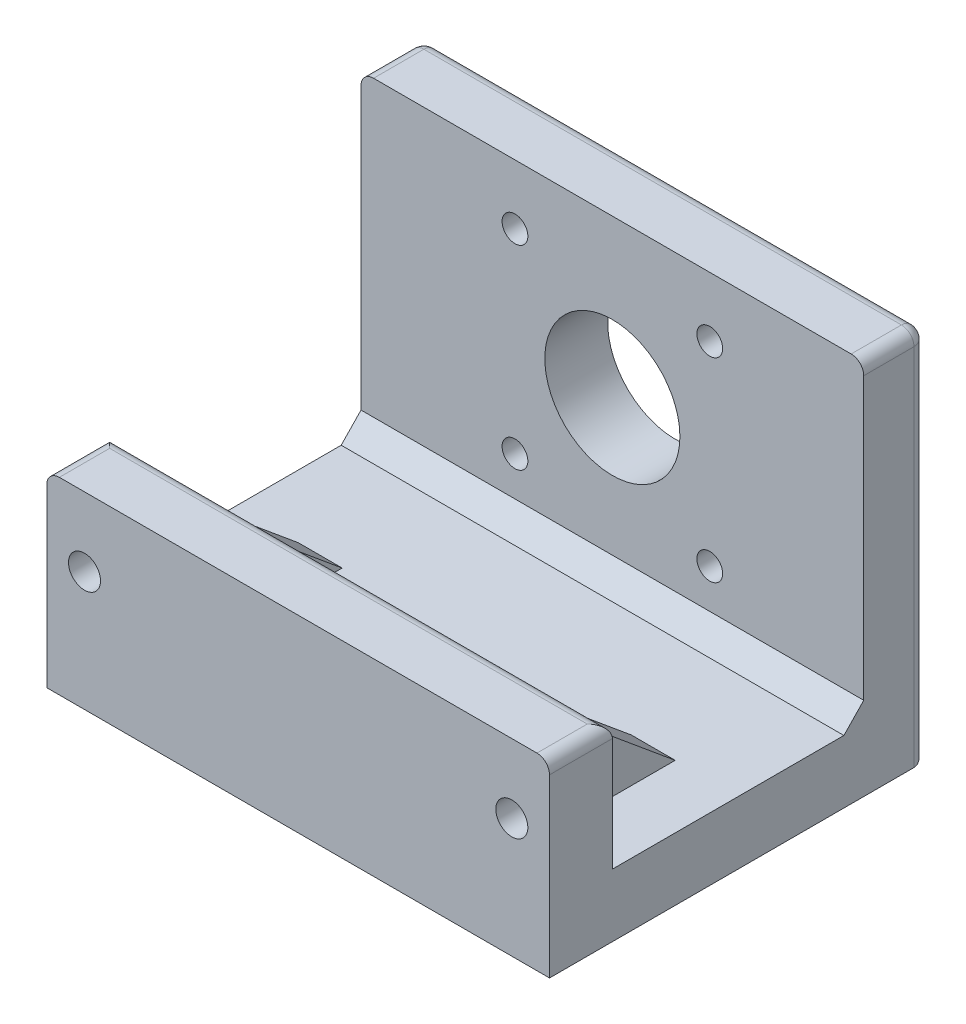
ISO-10303-21;
HEADER;
FILE_DESCRIPTION(('STEP AP214'),'2;1');
FILE_NAME('part.step','',(''),(''),'','','');
FILE_SCHEMA(('AUTOMOTIVE_DESIGN { 1 0 10303 214 1 1 1 1 }'));
ENDSEC;
DATA;
#1=APPLICATION_CONTEXT('core data for automotive mechanical design processes');
#2=APPLICATION_PROTOCOL_DEFINITION('international standard','automotive_design',2000,#1);
#3=PRODUCT_CONTEXT('',#1,'mechanical');
#4=PRODUCT('Part','Part','',(#3));
#5=PRODUCT_RELATED_PRODUCT_CATEGORY('part','',(#4));
#6=PRODUCT_DEFINITION_FORMATION('','',#4);
#7=PRODUCT_DEFINITION_CONTEXT('part definition',#1,'design');
#8=PRODUCT_DEFINITION('design','',#6,#7);
#9=PRODUCT_DEFINITION_SHAPE('','',#8);
#10=(LENGTH_UNIT() NAMED_UNIT(*) SI_UNIT(.MILLI.,.METRE.));
#11=(NAMED_UNIT(*) PLANE_ANGLE_UNIT() SI_UNIT($,.RADIAN.));
#12=(NAMED_UNIT(*) SI_UNIT($,.STERADIAN.) SOLID_ANGLE_UNIT());
#13=UNCERTAINTY_MEASURE_WITH_UNIT(LENGTH_MEASURE(1.E-05),#10,'distance_accuracy_value','');
#14=(GEOMETRIC_REPRESENTATION_CONTEXT(3) GLOBAL_UNCERTAINTY_ASSIGNED_CONTEXT((#13)) GLOBAL_UNIT_ASSIGNED_CONTEXT((#10,
#11,#12)) REPRESENTATION_CONTEXT('',''));
#15=CARTESIAN_POINT('',(0.,0.,0.));
#16=DIRECTION('',(0.,0.,1.));
#17=DIRECTION('',(1.,0.,0.));
#18=AXIS2_PLACEMENT_3D('',#15,#16,#17);
#19=CARTESIAN_POINT('',(0.,10.,0.));
#20=DIRECTION('',(0.,1.,0.));
#21=DIRECTION('',(0.,0.,1.));
#22=AXIS2_PLACEMENT_3D('',#19,#20,#21);
#23=PLANE('',#22);
#24=DIRECTION('',(0.,0.,-1.));
#25=VECTOR('',#24,1.);
#26=CARTESIAN_POINT('',(40.,10.,30.));
#27=LINE('',#26,#25);
#28=CARTESIAN_POINT('',(40.,10.,20.));
#29=VERTEX_POINT('',#28);
#30=CARTESIAN_POINT('',(40.,10.,-16.8467710974386));
#31=VERTEX_POINT('',#30);
#32=EDGE_CURVE('E207',#29,#31,#27,.T.);
#33=ORIENTED_EDGE('',*,*,#32,.T.);
#34=DIRECTION('',(-1.,0.,0.));
#35=VECTOR('',#34,1.);
#36=CARTESIAN_POINT('',(40.,10.,-16.8467710974386));
#37=LINE('',#36,#35);
#38=CARTESIAN_POINT('',(-40.,10.,-16.8467710974386));
#39=VERTEX_POINT('',#38);
#40=EDGE_CURVE('E187',#31,#39,#37,.T.);
#41=ORIENTED_EDGE('',*,*,#40,.T.);
#42=DIRECTION('',(0.,0.,1.));
#43=VECTOR('',#42,1.);
#44=CARTESIAN_POINT('',(-40.,10.,30.));
#45=LINE('',#44,#43);
#46=CARTESIAN_POINT('',(-40.,10.,20.));
#47=VERTEX_POINT('',#46);
#48=EDGE_CURVE('E230',#39,#47,#45,.T.);
#49=ORIENTED_EDGE('',*,*,#48,.T.);
#50=DIRECTION('',(1.,0.,0.));
#51=VECTOR('',#50,1.);
#52=CARTESIAN_POINT('',(47.9449323667304,10.,20.));
#53=LINE('',#52,#51);
#54=CARTESIAN_POINT('',(-30.,10.,20.));
#55=VERTEX_POINT('',#54);
#56=EDGE_CURVE('E378',#47,#55,#53,.T.);
#57=ORIENTED_EDGE('',*,*,#56,.T.);
#58=DIRECTION('',(0.,0.,1.));
#59=VECTOR('',#58,1.);
#60=CARTESIAN_POINT('',(-30.,10.,0.));
#61=LINE('',#60,#59);
#62=CARTESIAN_POINT('',(-30.,10.,0.));
#63=VERTEX_POINT('',#62);
#64=EDGE_CURVE('E457',#63,#55,#61,.T.);
#65=ORIENTED_EDGE('',*,*,#64,.F.);
#66=DIRECTION('',(-1.,0.,0.));
#67=VECTOR('',#66,1.);
#68=CARTESIAN_POINT('',(-30.,10.,0.));
#69=LINE('',#68,#67);
#70=CARTESIAN_POINT('',(-23.,10.,0.));
#71=VERTEX_POINT('',#70);
#72=EDGE_CURVE('E460',#71,#63,#69,.T.);
#73=ORIENTED_EDGE('',*,*,#72,.F.);
#74=DIRECTION('',(0.,0.,1.));
#75=VECTOR('',#74,1.);
#76=CARTESIAN_POINT('',(-23.,10.,0.));
#77=LINE('',#76,#75);
#78=CARTESIAN_POINT('',(-23.,10.,20.));
#79=VERTEX_POINT('',#78);
#80=EDGE_CURVE('E454',#71,#79,#77,.T.);
#81=ORIENTED_EDGE('',*,*,#80,.T.);
#82=CARTESIAN_POINT('',(23.,10.,20.));
#83=VERTEX_POINT('',#82);
#84=EDGE_CURVE('E383',#79,#83,#53,.T.);
#85=ORIENTED_EDGE('',*,*,#84,.T.);
#86=DIRECTION('',(0.,0.,1.));
#87=VECTOR('',#86,1.);
#88=CARTESIAN_POINT('',(23.,10.,0.));
#89=LINE('',#88,#87);
#90=CARTESIAN_POINT('',(23.,10.,0.));
#91=VERTEX_POINT('',#90);
#92=EDGE_CURVE('E443',#91,#83,#89,.T.);
#93=ORIENTED_EDGE('',*,*,#92,.F.);
#94=DIRECTION('',(-1.,0.,0.));
#95=VECTOR('',#94,1.);
#96=CARTESIAN_POINT('',(30.,10.,0.));
#97=LINE('',#96,#95);
#98=CARTESIAN_POINT('',(30.,10.,0.));
#99=VERTEX_POINT('',#98);
#100=EDGE_CURVE('E446',#99,#91,#97,.T.);
#101=ORIENTED_EDGE('',*,*,#100,.F.);
#102=DIRECTION('',(0.,0.,1.));
#103=VECTOR('',#102,1.);
#104=CARTESIAN_POINT('',(30.,10.,0.));
#105=LINE('',#104,#103);
#106=CARTESIAN_POINT('',(30.,10.,20.));
#107=VERTEX_POINT('',#106);
#108=EDGE_CURVE('E433',#99,#107,#105,.T.);
#109=ORIENTED_EDGE('',*,*,#108,.T.);
#110=EDGE_CURVE('E384',#107,#29,#53,.T.);
#111=ORIENTED_EDGE('',*,*,#110,.T.);
#112=EDGE_LOOP('',(#33,#41,#49,#57,#65,#73,#81,#85,#93,#101,#109,#111));
#113=FACE_BOUND('',#112,.T.);
#114=ADVANCED_FACE('F42',(#113),#23,.T.);
#115=CARTESIAN_POINT('',(47.9449323667304,10.,-20.));
#116=DIRECTION('',(0.,0.,-1.));
#117=DIRECTION('',(-1.,0.,0.));
#118=AXIS2_PLACEMENT_3D('',#115,#116,#117);
#119=PLANE('',#118);
#120=CARTESIAN_POINT('',(0.,35.,-20.));
#121=DIRECTION('',(0.,0.,1.));
#122=DIRECTION('',(1.,0.,0.));
#123=AXIS2_PLACEMENT_3D('',#120,#121,#122);
#124=CIRCLE('',#123,10.75);
#125=CARTESIAN_POINT('',(10.75,35.,-20.));
#126=VERTEX_POINT('',#125);
#127=EDGE_CURVE('E401',#126,#126,#124,.T.);
#128=ORIENTED_EDGE('',*,*,#127,.F.);
#129=EDGE_LOOP('',(#128));
#130=FACE_BOUND('',#129,.T.);
#131=CARTESIAN_POINT('',(15.5,50.5000000000004,-20.));
#132=DIRECTION('',(0.,0.,1.));
#133=DIRECTION('',(1.,0.,0.));
#134=AXIS2_PLACEMENT_3D('',#131,#132,#133);
#135=CIRCLE('',#134,2.05);
#136=CARTESIAN_POINT('',(17.55,50.5000000000004,-20.));
#137=VERTEX_POINT('',#136);
#138=EDGE_CURVE('E407',#137,#137,#135,.T.);
#139=ORIENTED_EDGE('',*,*,#138,.F.);
#140=EDGE_LOOP('',(#139));
#141=FACE_BOUND('',#140,.T.);
#142=CARTESIAN_POINT('',(-15.4999999999997,19.5000000000002,-20.));
#143=DIRECTION('',(0.,0.,1.));
#144=DIRECTION('',(1.,0.,0.));
#145=AXIS2_PLACEMENT_3D('',#142,#143,#144);
#146=CIRCLE('',#145,2.05);
#147=CARTESIAN_POINT('',(-13.4499999999997,19.5000000000002,-20.));
#148=VERTEX_POINT('',#147);
#149=EDGE_CURVE('E410',#148,#148,#146,.T.);
#150=ORIENTED_EDGE('',*,*,#149,.F.);
#151=EDGE_LOOP('',(#150));
#152=FACE_BOUND('',#151,.T.);
#153=CARTESIAN_POINT('',(-15.5,50.5,-20.));
#154=DIRECTION('',(0.,0.,1.));
#155=DIRECTION('',(1.,0.,0.));
#156=AXIS2_PLACEMENT_3D('',#153,#154,#155);
#157=CIRCLE('',#156,2.05);
#158=CARTESIAN_POINT('',(-13.45,50.5,-20.));
#159=VERTEX_POINT('',#158);
#160=EDGE_CURVE('E421',#159,#159,#157,.T.);
#161=ORIENTED_EDGE('',*,*,#160,.F.);
#162=EDGE_LOOP('',(#161));
#163=FACE_BOUND('',#162,.T.);
#164=CARTESIAN_POINT('',(15.5000000000003,19.5000000000003,-20.));
#165=DIRECTION('',(0.,0.,1.));
#166=DIRECTION('',(1.,0.,0.));
#167=AXIS2_PLACEMENT_3D('',#164,#165,#166);
#168=CIRCLE('',#167,2.05);
#169=CARTESIAN_POINT('',(17.5500000000003,19.5000000000003,-20.));
#170=VERTEX_POINT('',#169);
#171=EDGE_CURVE('E415',#170,#170,#168,.T.);
#172=ORIENTED_EDGE('',*,*,#171,.F.);
#173=EDGE_LOOP('',(#172));
#174=FACE_BOUND('',#173,.T.);
#175=DIRECTION('',(-1.,0.,0.));
#176=VECTOR('',#175,1.);
#177=CARTESIAN_POINT('',(40.,13.27,-20.));
#178=LINE('',#177,#176);
#179=CARTESIAN_POINT('',(40.,13.27,-20.));
#180=VERTEX_POINT('',#179);
#181=CARTESIAN_POINT('',(-40.,13.27,-20.));
#182=VERTEX_POINT('',#181);
#183=EDGE_CURVE('E59',#180,#182,#178,.T.);
#184=ORIENTED_EDGE('',*,*,#183,.F.);
#185=DIRECTION('',(0.,-1.,0.));
#186=VECTOR('',#185,1.);
#187=CARTESIAN_POINT('',(40.,60.,-20.));
#188=LINE('',#187,#186);
#189=CARTESIAN_POINT('',(40.,58.,-20.));
#190=VERTEX_POINT('',#189);
#191=EDGE_CURVE('E198',#190,#180,#188,.T.);
#192=ORIENTED_EDGE('',*,*,#191,.F.);
#193=CARTESIAN_POINT('',(38.,58.,-20.));
#194=DIRECTION('',(0.,0.,-1.));
#195=DIRECTION('',(-1.,0.,0.));
#196=AXIS2_PLACEMENT_3D('',#193,#194,#195);
#197=CIRCLE('',#196,2.);
#198=CARTESIAN_POINT('',(38.,60.,-20.));
#199=VERTEX_POINT('',#198);
#200=EDGE_CURVE('E11',#190,#199,#197,.F.);
#201=ORIENTED_EDGE('',*,*,#200,.T.);
#202=DIRECTION('',(1.,0.,0.));
#203=VECTOR('',#202,1.);
#204=CARTESIAN_POINT('',(0.,60.,-20.));
#205=LINE('',#204,#203);
#206=CARTESIAN_POINT('',(-38.,60.,-20.));
#207=VERTEX_POINT('',#206);
#208=EDGE_CURVE('E227',#207,#199,#205,.T.);
#209=ORIENTED_EDGE('',*,*,#208,.F.);
#210=CARTESIAN_POINT('',(-38.,58.,-20.));
#211=DIRECTION('',(0.,0.,-1.));
#212=DIRECTION('',(-1.,0.,0.));
#213=AXIS2_PLACEMENT_3D('',#210,#211,#212);
#214=CIRCLE('',#213,2.);
#215=CARTESIAN_POINT('',(-40.,58.,-20.));
#216=VERTEX_POINT('',#215);
#217=EDGE_CURVE('E51',#207,#216,#214,.F.);
#218=ORIENTED_EDGE('',*,*,#217,.T.);
#219=DIRECTION('',(0.,1.,0.));
#220=VECTOR('',#219,1.);
#221=CARTESIAN_POINT('',(-40.,60.,-20.));
#222=LINE('',#221,#220);
#223=EDGE_CURVE('E201',#182,#216,#222,.T.);
#224=ORIENTED_EDGE('',*,*,#223,.F.);
#225=EDGE_LOOP('',(#184,#192,#201,#209,#218,#224));
#226=FACE_BOUND('',#225,.T.);
#227=ADVANCED_FACE('F197',(#130,#141,#152,#163,#174,#226),#119,.F.);
#228=CARTESIAN_POINT('',(47.9449323667304,10.,20.));
#229=DIRECTION('',(0.,0.,1.));
#230=DIRECTION('',(1.,0.,0.));
#231=AXIS2_PLACEMENT_3D('',#228,#229,#230);
#232=PLANE('',#231);
#233=CARTESIAN_POINT('',(34.,19.,20.));
#234=DIRECTION('',(0.,0.,-1.));
#235=DIRECTION('',(-1.,0.,0.));
#236=AXIS2_PLACEMENT_3D('',#233,#234,#235);
#237=CIRCLE('',#236,2.55);
#238=CARTESIAN_POINT('',(31.45,19.,20.));
#239=VERTEX_POINT('',#238);
#240=EDGE_CURVE('E436',#239,#239,#237,.T.);
#241=ORIENTED_EDGE('',*,*,#240,.F.);
#242=EDGE_LOOP('',(#241));
#243=FACE_BOUND('',#242,.T.);
#244=DIRECTION('',(0.,-1.,0.));
#245=VECTOR('',#244,1.);
#246=CARTESIAN_POINT('',(30.,10.,20.));
#247=LINE('',#246,#245);
#248=CARTESIAN_POINT('',(30.,26.5997799259736,20.));
#249=VERTEX_POINT('',#248);
#250=EDGE_CURVE('E452',#249,#107,#247,.T.);
#251=ORIENTED_EDGE('',*,*,#250,.F.);
#252=DIRECTION('',(1.,0.,0.));
#253=VECTOR('',#252,1.);
#254=CARTESIAN_POINT('',(30.,26.5997799259736,20.));
#255=LINE('',#254,#253);
#256=CARTESIAN_POINT('',(23.,26.5997799259736,20.));
#257=VERTEX_POINT('',#256);
#258=EDGE_CURVE('E447',#257,#249,#255,.T.);
#259=ORIENTED_EDGE('',*,*,#258,.F.);
#260=DIRECTION('',(0.,1.,0.));
#261=VECTOR('',#260,1.);
#262=CARTESIAN_POINT('',(23.,10.,20.));
#263=LINE('',#262,#261);
#264=EDGE_CURVE('E449',#83,#257,#263,.T.);
#265=ORIENTED_EDGE('',*,*,#264,.F.);
#266=ORIENTED_EDGE('',*,*,#84,.F.);
#267=DIRECTION('',(0.,-1.,0.));
#268=VECTOR('',#267,1.);
#269=CARTESIAN_POINT('',(-23.,10.,20.));
#270=LINE('',#269,#268);
#271=CARTESIAN_POINT('',(-23.,26.5997799259736,20.));
#272=VERTEX_POINT('',#271);
#273=EDGE_CURVE('E461',#272,#79,#270,.T.);
#274=ORIENTED_EDGE('',*,*,#273,.F.);
#275=DIRECTION('',(1.,0.,0.));
#276=VECTOR('',#275,1.);
#277=CARTESIAN_POINT('',(-30.,26.5997799259736,20.));
#278=LINE('',#277,#276);
#279=CARTESIAN_POINT('',(-30.,26.5997799259736,20.));
#280=VERTEX_POINT('',#279);
#281=EDGE_CURVE('E464',#280,#272,#278,.T.);
#282=ORIENTED_EDGE('',*,*,#281,.F.);
#283=DIRECTION('',(0.,1.,0.));
#284=VECTOR('',#283,1.);
#285=CARTESIAN_POINT('',(-30.,10.,20.));
#286=LINE('',#285,#284);
#287=EDGE_CURVE('E466',#55,#280,#286,.T.);
#288=ORIENTED_EDGE('',*,*,#287,.F.);
#289=ORIENTED_EDGE('',*,*,#56,.F.);
#290=DIRECTION('',(0.,-1.,0.));
#291=VECTOR('',#290,1.);
#292=CARTESIAN_POINT('',(-40.,60.,20.));
#293=LINE('',#292,#291);
#294=CARTESIAN_POINT('',(-40.,28.,20.));
#295=VERTEX_POINT('',#294);
#296=EDGE_CURVE('E374',#295,#47,#293,.T.);
#297=ORIENTED_EDGE('',*,*,#296,.F.);
#298=DIRECTION('',(-1.,0.,0.));
#299=VECTOR('',#298,1.);
#300=CARTESIAN_POINT('',(40.,28.,20.));
#301=LINE('',#300,#299);
#302=CARTESIAN_POINT('',(40.,28.,20.));
#303=VERTEX_POINT('',#302);
#304=EDGE_CURVE('E254',#295,#303,#301,.F.);
#305=ORIENTED_EDGE('',*,*,#304,.T.);
#306=DIRECTION('',(0.,1.,0.));
#307=VECTOR('',#306,1.);
#308=CARTESIAN_POINT('',(40.,60.,20.));
#309=LINE('',#308,#307);
#310=EDGE_CURVE('E211',#29,#303,#309,.T.);
#311=ORIENTED_EDGE('',*,*,#310,.F.);
#312=ORIENTED_EDGE('',*,*,#110,.F.);
#313=EDGE_LOOP('',(#251,#259,#265,#266,#274,#282,#288,#289,#297,#305,#311,#312));
#314=FACE_BOUND('',#313,.T.);
#315=CARTESIAN_POINT('',(-34.,19.,20.));
#316=DIRECTION('',(0.,0.,-1.));
#317=DIRECTION('',(-1.,0.,0.));
#318=AXIS2_PLACEMENT_3D('',#315,#316,#317);
#319=CIRCLE('',#318,2.55);
#320=CARTESIAN_POINT('',(-36.55,19.,20.));
#321=VERTEX_POINT('',#320);
#322=EDGE_CURVE('E429',#321,#321,#319,.T.);
#323=ORIENTED_EDGE('',*,*,#322,.F.);
#324=EDGE_LOOP('',(#323));
#325=FACE_BOUND('',#324,.T.);
#326=ADVANCED_FACE('F370',(#243,#314,#325),#232,.F.);
#327=CARTESIAN_POINT('',(40.,60.,30.));
#328=DIRECTION('',(-1.,0.,0.));
#329=DIRECTION('',(0.,0.,1.));
#330=AXIS2_PLACEMENT_3D('',#327,#328,#329);
#331=PLANE('',#330);
#332=ORIENTED_EDGE('',*,*,#310,.T.);
#333=DIRECTION('',(0.,0.,-1.));
#334=VECTOR('',#333,1.);
#335=CARTESIAN_POINT('',(40.,28.,30.));
#336=LINE('',#335,#334);
#337=CARTESIAN_POINT('',(40.,28.,30.));
#338=VERTEX_POINT('',#337);
#339=EDGE_CURVE('E252',#303,#338,#336,.F.);
#340=ORIENTED_EDGE('',*,*,#339,.T.);
#341=DIRECTION('',(0.,-1.,0.));
#342=VECTOR('',#341,1.);
#343=CARTESIAN_POINT('',(40.,60.,30.));
#344=LINE('',#343,#342);
#345=CARTESIAN_POINT('',(40.,0.,30.));
#346=VERTEX_POINT('',#345);
#347=EDGE_CURVE('E222',#338,#346,#344,.T.);
#348=ORIENTED_EDGE('',*,*,#347,.T.);
#349=DIRECTION('',(0.,0.,-1.));
#350=VECTOR('',#349,1.);
#351=CARTESIAN_POINT('',(40.,0.,30.));
#352=LINE('',#351,#350);
#353=CARTESIAN_POINT('',(40.,0.,-28.));
#354=VERTEX_POINT('',#353);
#355=EDGE_CURVE('E209',#346,#354,#352,.T.);
#356=ORIENTED_EDGE('',*,*,#355,.T.);
#357=DIRECTION('',(0.,-1.,0.));
#358=VECTOR('',#357,1.);
#359=CARTESIAN_POINT('',(40.,60.,-28.));
#360=LINE('',#359,#358);
#361=CARTESIAN_POINT('',(40.,58.,-28.));
#362=VERTEX_POINT('',#361);
#363=EDGE_CURVE('E250',#354,#362,#360,.F.);
#364=ORIENTED_EDGE('',*,*,#363,.T.);
#365=DIRECTION('',(0.,0.,-1.));
#366=VECTOR('',#365,1.);
#367=CARTESIAN_POINT('',(40.,58.,30.));
#368=LINE('',#367,#366);
#369=EDGE_CURVE('E206',#362,#190,#368,.F.);
#370=ORIENTED_EDGE('',*,*,#369,.T.);
#371=ORIENTED_EDGE('',*,*,#191,.T.);
#372=DIRECTION('',(0.,-0.719842687639517,0.694137237908986));
#373=VECTOR('',#372,1.);
#374=CARTESIAN_POINT('',(40.,13.27,-20.));
#375=LINE('',#374,#373);
#376=EDGE_CURVE('E184',#180,#31,#375,.T.);
#377=ORIENTED_EDGE('',*,*,#376,.T.);
#378=ORIENTED_EDGE('',*,*,#32,.F.);
#379=EDGE_LOOP('',(#332,#340,#348,#356,#364,#370,#371,#377,#378));
#380=FACE_BOUND('',#379,.T.);
#381=ADVANCED_FACE('F203',(#380),#331,.F.);
#382=CARTESIAN_POINT('',(-40.,60.,30.));
#383=DIRECTION('',(1.,0.,0.));
#384=DIRECTION('',(0.,0.,-1.));
#385=AXIS2_PLACEMENT_3D('',#382,#383,#384);
#386=PLANE('',#385);
#387=ORIENTED_EDGE('',*,*,#48,.F.);
#388=DIRECTION('',(0.,-0.719842687639517,0.694137237908986));
#389=VECTOR('',#388,1.);
#390=CARTESIAN_POINT('',(-40.,13.27,-20.));
#391=LINE('',#390,#389);
#392=EDGE_CURVE('E192',#182,#39,#391,.T.);
#393=ORIENTED_EDGE('',*,*,#392,.F.);
#394=ORIENTED_EDGE('',*,*,#223,.T.);
#395=DIRECTION('',(0.,0.,1.));
#396=VECTOR('',#395,1.);
#397=CARTESIAN_POINT('',(-40.,58.,30.));
#398=LINE('',#397,#396);
#399=CARTESIAN_POINT('',(-40.,58.,-28.));
#400=VERTEX_POINT('',#399);
#401=EDGE_CURVE('E245',#216,#400,#398,.F.);
#402=ORIENTED_EDGE('',*,*,#401,.T.);
#403=DIRECTION('',(0.,-1.,0.));
#404=VECTOR('',#403,1.);
#405=CARTESIAN_POINT('',(-40.,60.,-28.));
#406=LINE('',#405,#404);
#407=CARTESIAN_POINT('',(-40.,0.,-28.));
#408=VERTEX_POINT('',#407);
#409=EDGE_CURVE('E243',#400,#408,#406,.T.);
#410=ORIENTED_EDGE('',*,*,#409,.T.);
#411=DIRECTION('',(0.,0.,1.));
#412=VECTOR('',#411,1.);
#413=CARTESIAN_POINT('',(-40.,0.,30.));
#414=LINE('',#413,#412);
#415=CARTESIAN_POINT('',(-40.,0.,30.));
#416=VERTEX_POINT('',#415);
#417=EDGE_CURVE('E217',#408,#416,#414,.T.);
#418=ORIENTED_EDGE('',*,*,#417,.T.);
#419=DIRECTION('',(0.,-1.,0.));
#420=VECTOR('',#419,1.);
#421=CARTESIAN_POINT('',(-40.,60.,30.));
#422=LINE('',#421,#420);
#423=CARTESIAN_POINT('',(-40.,28.,30.));
#424=VERTEX_POINT('',#423);
#425=EDGE_CURVE('E224',#424,#416,#422,.T.);
#426=ORIENTED_EDGE('',*,*,#425,.F.);
#427=DIRECTION('',(0.,0.,1.));
#428=VECTOR('',#427,1.);
#429=CARTESIAN_POINT('',(-40.,28.,20.));
#430=LINE('',#429,#428);
#431=EDGE_CURVE('E247',#424,#295,#430,.F.);
#432=ORIENTED_EDGE('',*,*,#431,.T.);
#433=ORIENTED_EDGE('',*,*,#296,.T.);
#434=EDGE_LOOP('',(#387,#393,#394,#402,#410,#418,#426,#432,#433));
#435=FACE_BOUND('',#434,.T.);
#436=ADVANCED_FACE('F343',(#435),#386,.F.);
#437=CARTESIAN_POINT('',(-40.,60.,30.));
#438=DIRECTION('',(0.,0.,-1.));
#439=DIRECTION('',(-1.,0.,0.));
#440=AXIS2_PLACEMENT_3D('',#437,#438,#439);
#441=PLANE('',#440);
#442=CARTESIAN_POINT('',(34.,19.,30.));
#443=DIRECTION('',(0.,0.,-1.));
#444=DIRECTION('',(-1.,0.,0.));
#445=AXIS2_PLACEMENT_3D('',#442,#443,#444);
#446=CIRCLE('',#445,2.55);
#447=CARTESIAN_POINT('',(31.45,19.,30.));
#448=VERTEX_POINT('',#447);
#449=EDGE_CURVE('E285',#448,#448,#446,.T.);
#450=ORIENTED_EDGE('',*,*,#449,.T.);
#451=EDGE_LOOP('',(#450));
#452=FACE_BOUND('',#451,.T.);
#453=CARTESIAN_POINT('',(-34.,19.,30.));
#454=DIRECTION('',(0.,0.,-1.));
#455=DIRECTION('',(-1.,0.,0.));
#456=AXIS2_PLACEMENT_3D('',#453,#454,#455);
#457=CIRCLE('',#456,2.55);
#458=CARTESIAN_POINT('',(-36.55,19.,30.));
#459=VERTEX_POINT('',#458);
#460=EDGE_CURVE('E432',#459,#459,#457,.T.);
#461=ORIENTED_EDGE('',*,*,#460,.T.);
#462=EDGE_LOOP('',(#461));
#463=FACE_BOUND('',#462,.T.);
#464=DIRECTION('',(1.,0.,0.));
#465=VECTOR('',#464,1.);
#466=CARTESIAN_POINT('',(-40.,30.,30.));
#467=LINE('',#466,#465);
#468=CARTESIAN_POINT('',(-38.,30.,30.));
#469=VERTEX_POINT('',#468);
#470=CARTESIAN_POINT('',(38.,30.,30.));
#471=VERTEX_POINT('',#470);
#472=EDGE_CURVE('E385',#469,#471,#467,.T.);
#473=ORIENTED_EDGE('',*,*,#472,.F.);
#474=CARTESIAN_POINT('',(-38.,28.,30.));
#475=DIRECTION('',(0.,0.,-1.));
#476=DIRECTION('',(-1.,0.,0.));
#477=AXIS2_PLACEMENT_3D('',#474,#475,#476);
#478=CIRCLE('',#477,2.);
#479=EDGE_CURVE('E241',#469,#424,#478,.F.);
#480=ORIENTED_EDGE('',*,*,#479,.T.);
#481=ORIENTED_EDGE('',*,*,#425,.T.);
#482=DIRECTION('',(1.,0.,0.));
#483=VECTOR('',#482,1.);
#484=CARTESIAN_POINT('',(-40.,0.,30.));
#485=LINE('',#484,#483);
#486=EDGE_CURVE('E219',#416,#346,#485,.T.);
#487=ORIENTED_EDGE('',*,*,#486,.T.);
#488=ORIENTED_EDGE('',*,*,#347,.F.);
#489=CARTESIAN_POINT('',(38.,28.,30.));
#490=DIRECTION('',(0.,0.,-1.));
#491=DIRECTION('',(-1.,0.,0.));
#492=AXIS2_PLACEMENT_3D('',#489,#490,#491);
#493=CIRCLE('',#492,2.);
#494=EDGE_CURVE('E239',#338,#471,#493,.F.);
#495=ORIENTED_EDGE('',*,*,#494,.T.);
#496=EDGE_LOOP('',(#473,#480,#481,#487,#488,#495));
#497=FACE_BOUND('',#496,.T.);
#498=ADVANCED_FACE('F352',(#452,#463,#497),#441,.F.);
#499=CARTESIAN_POINT('',(0.,60.,0.));
#500=DIRECTION('',(0.,-1.,0.));
#501=DIRECTION('',(0.,0.,-1.));
#502=AXIS2_PLACEMENT_3D('',#499,#500,#501);
#503=PLANE('',#502);
#504=ORIENTED_EDGE('',*,*,#208,.T.);
#505=DIRECTION('',(0.,0.,-1.));
#506=VECTOR('',#505,1.);
#507=CARTESIAN_POINT('',(38.,60.,0.));
#508=LINE('',#507,#506);
#509=CARTESIAN_POINT('',(38.,60.,-28.));
#510=VERTEX_POINT('',#509);
#511=EDGE_CURVE('E272',#199,#510,#508,.T.);
#512=ORIENTED_EDGE('',*,*,#511,.T.);
#513=DIRECTION('',(-1.,0.,0.));
#514=VECTOR('',#513,1.);
#515=CARTESIAN_POINT('',(0.,60.,-28.));
#516=LINE('',#515,#514);
#517=CARTESIAN_POINT('',(-38.,60.,-28.));
#518=VERTEX_POINT('',#517);
#519=EDGE_CURVE('E268',#510,#518,#516,.T.);
#520=ORIENTED_EDGE('',*,*,#519,.T.);
#521=DIRECTION('',(0.,0.,1.));
#522=VECTOR('',#521,1.);
#523=CARTESIAN_POINT('',(-38.,60.,0.));
#524=LINE('',#523,#522);
#525=EDGE_CURVE('E270',#518,#207,#524,.T.);
#526=ORIENTED_EDGE('',*,*,#525,.T.);
#527=EDGE_LOOP('',(#504,#512,#520,#526));
#528=FACE_BOUND('',#527,.T.);
#529=ADVANCED_FACE('F316',(#528),#503,.F.);
#530=CARTESIAN_POINT('',(-40.,60.,-30.));
#531=DIRECTION('',(0.,0.,1.));
#532=DIRECTION('',(1.,0.,0.));
#533=AXIS2_PLACEMENT_3D('',#530,#531,#532);
#534=PLANE('',#533);
#535=DIRECTION('',(-1.,0.,0.));
#536=VECTOR('',#535,1.);
#537=CARTESIAN_POINT('',(-40.,58.,-30.));
#538=LINE('',#537,#536);
#539=CARTESIAN_POINT('',(-38.,58.,-30.));
#540=VERTEX_POINT('',#539);
#541=CARTESIAN_POINT('',(38.,58.,-30.));
#542=VERTEX_POINT('',#541);
#543=EDGE_CURVE('E257',#540,#542,#538,.F.);
#544=ORIENTED_EDGE('',*,*,#543,.T.);
#545=DIRECTION('',(0.,-1.,0.));
#546=VECTOR('',#545,1.);
#547=CARTESIAN_POINT('',(38.,60.,-30.));
#548=LINE('',#547,#546);
#549=CARTESIAN_POINT('',(38.,2.,-30.));
#550=VERTEX_POINT('',#549);
#551=EDGE_CURVE('E263',#542,#550,#548,.T.);
#552=ORIENTED_EDGE('',*,*,#551,.T.);
#553=DIRECTION('',(-1.,0.,0.));
#554=VECTOR('',#553,1.);
#555=CARTESIAN_POINT('',(-40.,2.,-30.));
#556=LINE('',#555,#554);
#557=CARTESIAN_POINT('',(-38.,2.,-30.));
#558=VERTEX_POINT('',#557);
#559=EDGE_CURVE('E261',#550,#558,#556,.T.);
#560=ORIENTED_EDGE('',*,*,#559,.T.);
#561=DIRECTION('',(0.,-1.,0.));
#562=VECTOR('',#561,1.);
#563=CARTESIAN_POINT('',(-38.,60.,-30.));
#564=LINE('',#563,#562);
#565=EDGE_CURVE('E259',#558,#540,#564,.F.);
#566=ORIENTED_EDGE('',*,*,#565,.T.);
#567=EDGE_LOOP('',(#544,#552,#560,#566));
#568=FACE_BOUND('',#567,.T.);
#569=CARTESIAN_POINT('',(15.5000000000003,19.5000000000003,-30.));
#570=DIRECTION('',(0.,0.,1.));
#571=DIRECTION('',(1.,0.,0.));
#572=AXIS2_PLACEMENT_3D('',#569,#570,#571);
#573=CIRCLE('',#572,2.05);
#574=CARTESIAN_POINT('',(17.5500000000003,19.5000000000003,-30.));
#575=VERTEX_POINT('',#574);
#576=EDGE_CURVE('E281',#575,#575,#573,.T.);
#577=ORIENTED_EDGE('',*,*,#576,.T.);
#578=EDGE_LOOP('',(#577));
#579=FACE_BOUND('',#578,.T.);
#580=CARTESIAN_POINT('',(-15.5,50.5,-30.));
#581=DIRECTION('',(0.,0.,1.));
#582=DIRECTION('',(1.,0.,0.));
#583=AXIS2_PLACEMENT_3D('',#580,#581,#582);
#584=CIRCLE('',#583,2.05);
#585=CARTESIAN_POINT('',(-13.45,50.5,-30.));
#586=VERTEX_POINT('',#585);
#587=EDGE_CURVE('E418',#586,#586,#584,.T.);
#588=ORIENTED_EDGE('',*,*,#587,.T.);
#589=EDGE_LOOP('',(#588));
#590=FACE_BOUND('',#589,.T.);
#591=CARTESIAN_POINT('',(-15.4999999999997,19.5000000000002,-30.));
#592=DIRECTION('',(0.,0.,1.));
#593=DIRECTION('',(1.,0.,0.));
#594=AXIS2_PLACEMENT_3D('',#591,#592,#593);
#595=CIRCLE('',#594,2.05);
#596=CARTESIAN_POINT('',(-13.4499999999997,19.5000000000002,-30.));
#597=VERTEX_POINT('',#596);
#598=EDGE_CURVE('E424',#597,#597,#595,.T.);
#599=ORIENTED_EDGE('',*,*,#598,.T.);
#600=EDGE_LOOP('',(#599));
#601=FACE_BOUND('',#600,.T.);
#602=CARTESIAN_POINT('',(15.5,50.5000000000004,-30.));
#603=DIRECTION('',(0.,0.,1.));
#604=DIRECTION('',(1.,0.,0.));
#605=AXIS2_PLACEMENT_3D('',#602,#603,#604);
#606=CIRCLE('',#605,2.05);
#607=CARTESIAN_POINT('',(17.55,50.5000000000004,-30.));
#608=VERTEX_POINT('',#607);
#609=EDGE_CURVE('E404',#608,#608,#606,.T.);
#610=ORIENTED_EDGE('',*,*,#609,.T.);
#611=EDGE_LOOP('',(#610));
#612=FACE_BOUND('',#611,.T.);
#613=CARTESIAN_POINT('',(0.,35.,-30.));
#614=DIRECTION('',(0.,0.,1.));
#615=DIRECTION('',(1.,0.,0.));
#616=AXIS2_PLACEMENT_3D('',#613,#614,#615);
#617=CIRCLE('',#616,10.75);
#618=CARTESIAN_POINT('',(10.75,35.,-30.));
#619=VERTEX_POINT('',#618);
#620=EDGE_CURVE('E393',#619,#619,#617,.T.);
#621=ORIENTED_EDGE('',*,*,#620,.T.);
#622=EDGE_LOOP('',(#621));
#623=FACE_BOUND('',#622,.T.);
#624=ADVANCED_FACE('F333',(#568,#579,#590,#601,#612,#623),#534,.F.);
#625=CARTESIAN_POINT('',(0.,0.,0.));
#626=DIRECTION('',(0.,-1.,0.));
#627=DIRECTION('',(0.,0.,-1.));
#628=AXIS2_PLACEMENT_3D('',#625,#626,#627);
#629=PLANE('',#628);
#630=CARTESIAN_POINT('',(-30.,0.,0.5));
#631=DIRECTION('',(0.,-1.,0.));
#632=DIRECTION('',(0.,0.,-1.));
#633=AXIS2_PLACEMENT_3D('',#630,#631,#632);
#634=CIRCLE('',#633,4.1);
#635=CARTESIAN_POINT('',(-30.,0.,-3.6));
#636=VERTEX_POINT('',#635);
#637=EDGE_CURVE('E396',#636,#636,#634,.T.);
#638=ORIENTED_EDGE('',*,*,#637,.F.);
#639=EDGE_LOOP('',(#638));
#640=FACE_BOUND('',#639,.T.);
#641=CARTESIAN_POINT('',(30.,0.,0.500000000000007));
#642=DIRECTION('',(0.,-1.,0.));
#643=DIRECTION('',(0.,0.,1.));
#644=AXIS2_PLACEMENT_3D('',#641,#642,#643);
#645=CIRCLE('',#644,4.1);
#646=CARTESIAN_POINT('',(30.,0.,4.60000000000001));
#647=VERTEX_POINT('',#646);
#648=EDGE_CURVE('E389',#647,#647,#645,.T.);
#649=ORIENTED_EDGE('',*,*,#648,.F.);
#650=EDGE_LOOP('',(#649));
#651=FACE_BOUND('',#650,.T.);
#652=ORIENTED_EDGE('',*,*,#417,.F.);
#653=DIRECTION('',(-1.,0.,0.));
#654=VECTOR('',#653,1.);
#655=CARTESIAN_POINT('',(40.,0.,-28.));
#656=LINE('',#655,#654);
#657=EDGE_CURVE('E266',#408,#354,#656,.F.);
#658=ORIENTED_EDGE('',*,*,#657,.T.);
#659=ORIENTED_EDGE('',*,*,#355,.F.);
#660=ORIENTED_EDGE('',*,*,#486,.F.);
#661=EDGE_LOOP('',(#652,#658,#659,#660));
#662=FACE_BOUND('',#661,.T.);
#663=ADVANCED_FACE('F347',(#640,#651,#662),#629,.T.);
#664=CARTESIAN_POINT('',(0.,30.,0.));
#665=DIRECTION('',(0.,1.,0.));
#666=DIRECTION('',(0.,0.,1.));
#667=AXIS2_PLACEMENT_3D('',#664,#665,#666);
#668=PLANE('',#667);
#669=DIRECTION('',(-1.,0.,0.));
#670=VECTOR('',#669,1.);
#671=CARTESIAN_POINT('',(-40.,30.,22.));
#672=LINE('',#671,#670);
#673=CARTESIAN_POINT('',(38.,30.,22.));
#674=VERTEX_POINT('',#673);
#675=CARTESIAN_POINT('',(-38.,30.,22.));
#676=VERTEX_POINT('',#675);
#677=EDGE_CURVE('E232',#674,#676,#672,.T.);
#678=ORIENTED_EDGE('',*,*,#677,.T.);
#679=DIRECTION('',(0.,0.,1.));
#680=VECTOR('',#679,1.);
#681=CARTESIAN_POINT('',(-38.,30.,30.));
#682=LINE('',#681,#680);
#683=EDGE_CURVE('E236',#676,#469,#682,.T.);
#684=ORIENTED_EDGE('',*,*,#683,.T.);
#685=ORIENTED_EDGE('',*,*,#472,.T.);
#686=DIRECTION('',(0.,0.,-1.));
#687=VECTOR('',#686,1.);
#688=CARTESIAN_POINT('',(38.,30.,20.));
#689=LINE('',#688,#687);
#690=EDGE_CURVE('E234',#471,#674,#689,.T.);
#691=ORIENTED_EDGE('',*,*,#690,.T.);
#692=EDGE_LOOP('',(#678,#684,#685,#691));
#693=FACE_BOUND('',#692,.T.);
#694=ADVANCED_FACE('F522',(#693),#668,.T.);
#695=CARTESIAN_POINT('',(30.,7.,0.500000000000007));
#696=DIRECTION('',(0.,-1.,0.));
#697=DIRECTION('',(0.,0.,-1.));
#698=AXIS2_PLACEMENT_3D('',#695,#696,#697);
#699=CYLINDRICAL_SURFACE('',#698,4.1);
#700=CARTESIAN_POINT('',(30.,7.,0.500000000000007));
#701=DIRECTION('',(0.,-1.,0.));
#702=DIRECTION('',(0.,0.,1.));
#703=AXIS2_PLACEMENT_3D('',#700,#701,#702);
#704=CIRCLE('',#703,4.1);
#705=CARTESIAN_POINT('',(30.,7.,4.60000000000001));
#706=VERTEX_POINT('',#705);
#707=EDGE_CURVE('E392',#706,#706,#704,.T.);
#708=ORIENTED_EDGE('',*,*,#707,.F.);
#709=EDGE_LOOP('',(#708));
#710=FACE_BOUND('',#709,.T.);
#711=ORIENTED_EDGE('',*,*,#648,.T.);
#712=EDGE_LOOP('',(#711));
#713=FACE_BOUND('',#712,.T.);
#714=ADVANCED_FACE('F644',(#710,#713),#699,.F.);
#715=CARTESIAN_POINT('',(30.,7.,0.500000000000007));
#716=DIRECTION('',(0.,1.,0.));
#717=DIRECTION('',(0.,0.,1.));
#718=AXIS2_PLACEMENT_3D('',#715,#716,#717);
#719=PLANE('',#718);
#720=ORIENTED_EDGE('',*,*,#707,.T.);
#721=EDGE_LOOP('',(#720));
#722=FACE_BOUND('',#721,.T.);
#723=ADVANCED_FACE('F636',(#722),#719,.F.);
#724=CARTESIAN_POINT('',(-30.,7.,0.5));
#725=DIRECTION('',(0.,-1.,0.));
#726=DIRECTION('',(0.,0.,-1.));
#727=AXIS2_PLACEMENT_3D('',#724,#725,#726);
#728=CYLINDRICAL_SURFACE('',#727,4.1);
#729=CARTESIAN_POINT('',(-30.,7.,0.5));
#730=DIRECTION('',(0.,-1.,0.));
#731=DIRECTION('',(0.,0.,-1.));
#732=AXIS2_PLACEMENT_3D('',#729,#730,#731);
#733=CIRCLE('',#732,4.1);
#734=CARTESIAN_POINT('',(-30.,7.,-3.6));
#735=VERTEX_POINT('',#734);
#736=EDGE_CURVE('E388',#735,#735,#733,.T.);
#737=ORIENTED_EDGE('',*,*,#736,.F.);
#738=EDGE_LOOP('',(#737));
#739=FACE_BOUND('',#738,.T.);
#740=ORIENTED_EDGE('',*,*,#637,.T.);
#741=EDGE_LOOP('',(#740));
#742=FACE_BOUND('',#741,.T.);
#743=ADVANCED_FACE('F628',(#739,#742),#728,.F.);
#744=CARTESIAN_POINT('',(-30.,7.,0.5));
#745=DIRECTION('',(0.,-1.,0.));
#746=DIRECTION('',(0.,0.,-1.));
#747=AXIS2_PLACEMENT_3D('',#744,#745,#746);
#748=PLANE('',#747);
#749=ORIENTED_EDGE('',*,*,#736,.T.);
#750=EDGE_LOOP('',(#749));
#751=FACE_BOUND('',#750,.T.);
#752=ADVANCED_FACE('F620',(#751),#748,.T.);
#753=CARTESIAN_POINT('',(0.,35.,-30.));
#754=DIRECTION('',(0.,0.,1.));
#755=DIRECTION('',(1.,0.,0.));
#756=AXIS2_PLACEMENT_3D('',#753,#754,#755);
#757=CYLINDRICAL_SURFACE('',#756,10.75);
#758=ORIENTED_EDGE('',*,*,#620,.F.);
#759=EDGE_LOOP('',(#758));
#760=FACE_BOUND('',#759,.T.);
#761=ORIENTED_EDGE('',*,*,#127,.T.);
#762=EDGE_LOOP('',(#761));
#763=FACE_BOUND('',#762,.T.);
#764=ADVANCED_FACE('F612',(#760,#763),#757,.F.);
#765=CARTESIAN_POINT('',(15.5,50.5000000000004,-30.));
#766=DIRECTION('',(0.,0.,1.));
#767=DIRECTION('',(1.,0.,0.));
#768=AXIS2_PLACEMENT_3D('',#765,#766,#767);
#769=CYLINDRICAL_SURFACE('',#768,2.05);
#770=ORIENTED_EDGE('',*,*,#609,.F.);
#771=EDGE_LOOP('',(#770));
#772=FACE_BOUND('',#771,.T.);
#773=ORIENTED_EDGE('',*,*,#138,.T.);
#774=EDGE_LOOP('',(#773));
#775=FACE_BOUND('',#774,.T.);
#776=ADVANCED_FACE('F604',(#772,#775),#769,.F.);
#777=CARTESIAN_POINT('',(-15.4999999999997,19.5000000000002,-30.));
#778=DIRECTION('',(0.,0.,1.));
#779=DIRECTION('',(1.,0.,0.));
#780=AXIS2_PLACEMENT_3D('',#777,#778,#779);
#781=CYLINDRICAL_SURFACE('',#780,2.05);
#782=ORIENTED_EDGE('',*,*,#598,.F.);
#783=EDGE_LOOP('',(#782));
#784=FACE_BOUND('',#783,.T.);
#785=ORIENTED_EDGE('',*,*,#149,.T.);
#786=EDGE_LOOP('',(#785));
#787=FACE_BOUND('',#786,.T.);
#788=ADVANCED_FACE('F596',(#784,#787),#781,.F.);
#789=CARTESIAN_POINT('',(-15.5,50.5,-30.));
#790=DIRECTION('',(0.,0.,1.));
#791=DIRECTION('',(1.,0.,0.));
#792=AXIS2_PLACEMENT_3D('',#789,#790,#791);
#793=CYLINDRICAL_SURFACE('',#792,2.05);
#794=ORIENTED_EDGE('',*,*,#587,.F.);
#795=EDGE_LOOP('',(#794));
#796=FACE_BOUND('',#795,.T.);
#797=ORIENTED_EDGE('',*,*,#160,.T.);
#798=EDGE_LOOP('',(#797));
#799=FACE_BOUND('',#798,.T.);
#800=ADVANCED_FACE('F587',(#796,#799),#793,.F.);
#801=CARTESIAN_POINT('',(15.5000000000003,19.5000000000003,-30.));
#802=DIRECTION('',(0.,0.,1.));
#803=DIRECTION('',(1.,0.,0.));
#804=AXIS2_PLACEMENT_3D('',#801,#802,#803);
#805=CYLINDRICAL_SURFACE('',#804,2.05);
#806=ORIENTED_EDGE('',*,*,#576,.F.);
#807=EDGE_LOOP('',(#806));
#808=FACE_BOUND('',#807,.T.);
#809=ORIENTED_EDGE('',*,*,#171,.T.);
#810=EDGE_LOOP('',(#809));
#811=FACE_BOUND('',#810,.T.);
#812=ADVANCED_FACE('F548',(#808,#811),#805,.F.);
#813=CARTESIAN_POINT('',(38.,28.,0.));
#814=DIRECTION('',(0.,0.,1.));
#815=DIRECTION('',(1.,0.,0.));
#816=AXIS2_PLACEMENT_3D('',#813,#814,#815);
#817=CYLINDRICAL_SURFACE('',#816,2.);
#818=ORIENTED_EDGE('',*,*,#494,.F.);
#819=ORIENTED_EDGE('',*,*,#339,.F.);
#820=CARTESIAN_POINT('',(38.,28.,22.));
#821=DIRECTION('',(0.707106781186548,0.,0.707106781186547));
#822=DIRECTION('',(0.707106781186547,0.,-0.707106781186548));
#823=AXIS2_PLACEMENT_3D('',#820,#821,#822);
#824=ELLIPSE('',#823,2.82842712474619,2.);
#825=EDGE_CURVE('E278',#674,#303,#824,.F.);
#826=ORIENTED_EDGE('',*,*,#825,.F.);
#827=ORIENTED_EDGE('',*,*,#690,.F.);
#828=EDGE_LOOP('',(#818,#819,#826,#827));
#829=FACE_BOUND('',#828,.T.);
#830=ADVANCED_FACE('F376',(#829),#817,.T.);
#831=CARTESIAN_POINT('',(0.,28.,22.));
#832=DIRECTION('',(1.,0.,0.));
#833=DIRECTION('',(0.,0.,-1.));
#834=AXIS2_PLACEMENT_3D('',#831,#832,#833);
#835=CYLINDRICAL_SURFACE('',#834,2.);
#836=ORIENTED_EDGE('',*,*,#825,.T.);
#837=ORIENTED_EDGE('',*,*,#304,.F.);
#838=CARTESIAN_POINT('',(-38.,28.,22.));
#839=DIRECTION('',(0.707106781186547,0.,-0.707106781186548));
#840=DIRECTION('',(0.707106781186548,0.,0.707106781186547));
#841=AXIS2_PLACEMENT_3D('',#838,#839,#840);
#842=ELLIPSE('',#841,2.82842712474619,2.);
#843=EDGE_CURVE('E275',#676,#295,#842,.F.);
#844=ORIENTED_EDGE('',*,*,#843,.F.);
#845=ORIENTED_EDGE('',*,*,#677,.F.);
#846=EDGE_LOOP('',(#836,#837,#844,#845));
#847=FACE_BOUND('',#846,.T.);
#848=ADVANCED_FACE('F364',(#847),#835,.T.);
#849=CARTESIAN_POINT('',(-38.,28.,0.));
#850=DIRECTION('',(0.,0.,-1.));
#851=DIRECTION('',(-1.,0.,0.));
#852=AXIS2_PLACEMENT_3D('',#849,#850,#851);
#853=CYLINDRICAL_SURFACE('',#852,2.);
#854=ORIENTED_EDGE('',*,*,#843,.T.);
#855=ORIENTED_EDGE('',*,*,#431,.F.);
#856=ORIENTED_EDGE('',*,*,#479,.F.);
#857=ORIENTED_EDGE('',*,*,#683,.F.);
#858=EDGE_LOOP('',(#854,#855,#856,#857));
#859=FACE_BOUND('',#858,.T.);
#860=ADVANCED_FACE('F358',(#859),#853,.T.);
#861=CARTESIAN_POINT('',(-38.,58.,0.));
#862=DIRECTION('',(0.,0.,1.));
#863=DIRECTION('',(1.,0.,0.));
#864=AXIS2_PLACEMENT_3D('',#861,#862,#863);
#865=CYLINDRICAL_SURFACE('',#864,2.);
#866=CARTESIAN_POINT('',(-38.,58.,-28.));
#867=DIRECTION('',(0.,0.,-1.));
#868=DIRECTION('',(0.,1.,0.));
#869=AXIS2_PLACEMENT_3D('',#866,#867,#868);
#870=CIRCLE('',#869,2.);
#871=EDGE_CURVE('E46',#400,#518,#870,.T.);
#872=ORIENTED_EDGE('',*,*,#871,.F.);
#873=ORIENTED_EDGE('',*,*,#401,.F.);
#874=ORIENTED_EDGE('',*,*,#217,.F.);
#875=ORIENTED_EDGE('',*,*,#525,.F.);
#876=EDGE_LOOP('',(#872,#873,#874,#875));
#877=FACE_BOUND('',#876,.T.);
#878=ADVANCED_FACE('F44',(#877),#865,.T.);
#879=CARTESIAN_POINT('',(-38.,58.,-28.));
#880=DIRECTION('',(0.,0.,1.));
#881=DIRECTION('',(1.,0.,0.));
#882=AXIS2_PLACEMENT_3D('',#879,#880,#881);
#883=SPHERICAL_SURFACE('',#882,2.);
#884=CARTESIAN_POINT('',(-38.,58.,-28.));
#885=DIRECTION('',(0.,1.,0.));
#886=DIRECTION('',(0.,0.,1.));
#887=AXIS2_PLACEMENT_3D('',#884,#885,#886);
#888=CIRCLE('',#887,2.);
#889=EDGE_CURVE('E296',#400,#540,#888,.F.);
#890=ORIENTED_EDGE('',*,*,#889,.F.);
#891=ORIENTED_EDGE('',*,*,#871,.T.);
#892=CARTESIAN_POINT('',(-38.,58.,-28.));
#893=DIRECTION('',(-1.,0.,0.));
#894=DIRECTION('',(0.,0.,1.));
#895=AXIS2_PLACEMENT_3D('',#892,#893,#894);
#896=CIRCLE('',#895,2.);
#897=EDGE_CURVE('E298',#540,#518,#896,.F.);
#898=ORIENTED_EDGE('',*,*,#897,.F.);
#899=EDGE_LOOP('',(#890,#891,#898));
#900=FACE_BOUND('',#899,.T.);
#901=ADVANCED_FACE('F308',(#900),#883,.T.);
#902=CARTESIAN_POINT('',(38.,58.,0.));
#903=DIRECTION('',(0.,0.,-1.));
#904=DIRECTION('',(-1.,0.,0.));
#905=AXIS2_PLACEMENT_3D('',#902,#903,#904);
#906=CYLINDRICAL_SURFACE('',#905,2.);
#907=ORIENTED_EDGE('',*,*,#200,.F.);
#908=ORIENTED_EDGE('',*,*,#369,.F.);
#909=CARTESIAN_POINT('',(38.,58.,-28.));
#910=DIRECTION('',(0.,0.,-1.));
#911=DIRECTION('',(-1.,0.,0.));
#912=AXIS2_PLACEMENT_3D('',#909,#910,#911);
#913=CIRCLE('',#912,2.);
#914=EDGE_CURVE('E293',#510,#362,#913,.T.);
#915=ORIENTED_EDGE('',*,*,#914,.F.);
#916=ORIENTED_EDGE('',*,*,#511,.F.);
#917=EDGE_LOOP('',(#907,#908,#915,#916));
#918=FACE_BOUND('',#917,.T.);
#919=ADVANCED_FACE('F319',(#918),#906,.T.);
#920=CARTESIAN_POINT('',(0.,58.,-28.));
#921=DIRECTION('',(-1.,0.,0.));
#922=DIRECTION('',(0.,0.,1.));
#923=AXIS2_PLACEMENT_3D('',#920,#921,#922);
#924=CYLINDRICAL_SURFACE('',#923,2.);
#925=ORIENTED_EDGE('',*,*,#897,.T.);
#926=ORIENTED_EDGE('',*,*,#519,.F.);
#927=CARTESIAN_POINT('',(38.,58.,-28.));
#928=DIRECTION('',(1.,0.,0.));
#929=DIRECTION('',(0.,1.,0.));
#930=AXIS2_PLACEMENT_3D('',#927,#928,#929);
#931=CIRCLE('',#930,2.);
#932=EDGE_CURVE('E290',#542,#510,#931,.T.);
#933=ORIENTED_EDGE('',*,*,#932,.F.);
#934=ORIENTED_EDGE('',*,*,#543,.F.);
#935=EDGE_LOOP('',(#925,#926,#933,#934));
#936=FACE_BOUND('',#935,.T.);
#937=ADVANCED_FACE('F322',(#936),#924,.T.);
#938=CARTESIAN_POINT('',(-38.,60.,-28.));
#939=DIRECTION('',(0.,-1.,0.));
#940=DIRECTION('',(0.,0.,-1.));
#941=AXIS2_PLACEMENT_3D('',#938,#939,#940);
#942=CYLINDRICAL_SURFACE('',#941,2.);
#943=ORIENTED_EDGE('',*,*,#889,.T.);
#944=ORIENTED_EDGE('',*,*,#565,.F.);
#945=CARTESIAN_POINT('',(-38.,2.,-28.));
#946=DIRECTION('',(0.707106781186547,-0.707106781186547,0.));
#947=DIRECTION('',(-0.707106781186547,-0.707106781186547,0.));
#948=AXIS2_PLACEMENT_3D('',#945,#946,#947);
#949=ELLIPSE('',#948,2.82842712474619,2.);
#950=EDGE_CURVE('E287',#408,#558,#949,.T.);
#951=ORIENTED_EDGE('',*,*,#950,.F.);
#952=ORIENTED_EDGE('',*,*,#409,.F.);
#953=EDGE_LOOP('',(#943,#944,#951,#952));
#954=FACE_BOUND('',#953,.T.);
#955=ADVANCED_FACE('F338',(#954),#942,.T.);
#956=CARTESIAN_POINT('',(38.,58.,-28.));
#957=DIRECTION('',(0.,0.,1.));
#958=DIRECTION('',(1.,0.,0.));
#959=AXIS2_PLACEMENT_3D('',#956,#957,#958);
#960=SPHERICAL_SURFACE('',#959,2.);
#961=ORIENTED_EDGE('',*,*,#932,.T.);
#962=ORIENTED_EDGE('',*,*,#914,.T.);
#963=CARTESIAN_POINT('',(38.,58.,-28.));
#964=DIRECTION('',(0.,1.,0.));
#965=DIRECTION('',(0.,0.,1.));
#966=AXIS2_PLACEMENT_3D('',#963,#964,#965);
#967=CIRCLE('',#966,2.);
#968=EDGE_CURVE('E284',#542,#362,#967,.F.);
#969=ORIENTED_EDGE('',*,*,#968,.F.);
#970=EDGE_LOOP('',(#961,#962,#969));
#971=FACE_BOUND('',#970,.T.);
#972=ADVANCED_FACE('F326',(#971),#960,.T.);
#973=CARTESIAN_POINT('',(-40.,2.,-28.));
#974=DIRECTION('',(1.,0.,0.));
#975=DIRECTION('',(0.,0.,-1.));
#976=AXIS2_PLACEMENT_3D('',#973,#974,#975);
#977=CYLINDRICAL_SURFACE('',#976,2.);
#978=ORIENTED_EDGE('',*,*,#950,.T.);
#979=ORIENTED_EDGE('',*,*,#559,.F.);
#980=CARTESIAN_POINT('',(38.,2.,-28.));
#981=DIRECTION('',(0.707106781186547,0.707106781186547,0.));
#982=DIRECTION('',(0.707106781186547,-0.707106781186547,0.));
#983=AXIS2_PLACEMENT_3D('',#980,#981,#982);
#984=ELLIPSE('',#983,2.82842712474619,2.);
#985=EDGE_CURVE('E282',#354,#550,#984,.T.);
#986=ORIENTED_EDGE('',*,*,#985,.F.);
#987=ORIENTED_EDGE('',*,*,#657,.F.);
#988=EDGE_LOOP('',(#978,#979,#986,#987));
#989=FACE_BOUND('',#988,.T.);
#990=ADVANCED_FACE('F551',(#989),#977,.T.);
#991=CARTESIAN_POINT('',(38.,60.,-28.));
#992=DIRECTION('',(0.,-1.,0.));
#993=DIRECTION('',(0.,0.,-1.));
#994=AXIS2_PLACEMENT_3D('',#991,#992,#993);
#995=CYLINDRICAL_SURFACE('',#994,2.);
#996=ORIENTED_EDGE('',*,*,#968,.T.);
#997=ORIENTED_EDGE('',*,*,#363,.F.);
#998=ORIENTED_EDGE('',*,*,#985,.T.);
#999=ORIENTED_EDGE('',*,*,#551,.F.);
#1000=EDGE_LOOP('',(#996,#997,#998,#999));
#1001=FACE_BOUND('',#1000,.T.);
#1002=ADVANCED_FACE('F329',(#1001),#995,.T.);
#1003=CARTESIAN_POINT('',(-34.,19.,30.));
#1004=DIRECTION('',(0.,0.,-1.));
#1005=DIRECTION('',(-1.,0.,0.));
#1006=AXIS2_PLACEMENT_3D('',#1003,#1004,#1005);
#1007=CYLINDRICAL_SURFACE('',#1006,2.55);
#1008=ORIENTED_EDGE('',*,*,#460,.F.);
#1009=EDGE_LOOP('',(#1008));
#1010=FACE_BOUND('',#1009,.T.);
#1011=ORIENTED_EDGE('',*,*,#322,.T.);
#1012=EDGE_LOOP('',(#1011));
#1013=FACE_BOUND('',#1012,.T.);
#1014=ADVANCED_FACE('F511',(#1010,#1013),#1007,.F.);
#1015=CARTESIAN_POINT('',(34.,19.,30.));
#1016=DIRECTION('',(0.,0.,-1.));
#1017=DIRECTION('',(-1.,0.,0.));
#1018=AXIS2_PLACEMENT_3D('',#1015,#1016,#1017);
#1019=CYLINDRICAL_SURFACE('',#1018,2.55);
#1020=ORIENTED_EDGE('',*,*,#449,.F.);
#1021=EDGE_LOOP('',(#1020));
#1022=FACE_BOUND('',#1021,.T.);
#1023=ORIENTED_EDGE('',*,*,#240,.T.);
#1024=EDGE_LOOP('',(#1023));
#1025=FACE_BOUND('',#1024,.T.);
#1026=ADVANCED_FACE('F504',(#1022,#1025),#1019,.F.);
#1027=CARTESIAN_POINT('',(30.,10.,0.));
#1028=DIRECTION('',(-1.,0.,0.));
#1029=DIRECTION('',(0.,-1.,0.));
#1030=AXIS2_PLACEMENT_3D('',#1027,#1028,#1029);
#1031=PLANE('',#1030);
#1032=ORIENTED_EDGE('',*,*,#108,.F.);
#1033=DIRECTION('',(0.,0.63866440984338,0.769485394013043));
#1034=VECTOR('',#1033,1.);
#1035=CARTESIAN_POINT('',(30.,10.,0.));
#1036=LINE('',#1035,#1034);
#1037=EDGE_CURVE('E469',#99,#249,#1036,.T.);
#1038=ORIENTED_EDGE('',*,*,#1037,.T.);
#1039=ORIENTED_EDGE('',*,*,#250,.T.);
#1040=EDGE_LOOP('',(#1032,#1038,#1039));
#1041=FACE_BOUND('',#1040,.T.);
#1042=ADVANCED_FACE('F502',(#1041),#1031,.F.);
#1043=CARTESIAN_POINT('',(23.,10.,0.));
#1044=DIRECTION('',(1.,0.,0.));
#1045=DIRECTION('',(0.,0.,-1.));
#1046=AXIS2_PLACEMENT_3D('',#1043,#1044,#1045);
#1047=PLANE('',#1046);
#1048=ORIENTED_EDGE('',*,*,#264,.T.);
#1049=DIRECTION('',(0.,-0.63866440984338,-0.769485394013043));
#1050=VECTOR('',#1049,1.);
#1051=CARTESIAN_POINT('',(23.,10.,0.));
#1052=LINE('',#1051,#1050);
#1053=EDGE_CURVE('E473',#257,#91,#1052,.T.);
#1054=ORIENTED_EDGE('',*,*,#1053,.T.);
#1055=ORIENTED_EDGE('',*,*,#92,.T.);
#1056=EDGE_LOOP('',(#1048,#1054,#1055));
#1057=FACE_BOUND('',#1056,.T.);
#1058=ADVANCED_FACE('F496',(#1057),#1047,.F.);
#1059=CARTESIAN_POINT('',(-30.,10.,0.));
#1060=DIRECTION('',(1.,0.,0.));
#1061=DIRECTION('',(0.,1.,0.));
#1062=AXIS2_PLACEMENT_3D('',#1059,#1060,#1061);
#1063=PLANE('',#1062);
#1064=ORIENTED_EDGE('',*,*,#287,.T.);
#1065=DIRECTION('',(0.,-0.63866440984338,-0.769485394013043));
#1066=VECTOR('',#1065,1.);
#1067=CARTESIAN_POINT('',(-30.,10.,0.));
#1068=LINE('',#1067,#1066);
#1069=EDGE_CURVE('E476',#280,#63,#1068,.T.);
#1070=ORIENTED_EDGE('',*,*,#1069,.T.);
#1071=ORIENTED_EDGE('',*,*,#64,.T.);
#1072=EDGE_LOOP('',(#1064,#1070,#1071));
#1073=FACE_BOUND('',#1072,.T.);
#1074=ADVANCED_FACE('F485',(#1073),#1063,.F.);
#1075=CARTESIAN_POINT('',(-23.,10.,0.));
#1076=DIRECTION('',(-1.,0.,0.));
#1077=DIRECTION('',(0.,-1.,0.));
#1078=AXIS2_PLACEMENT_3D('',#1075,#1076,#1077);
#1079=PLANE('',#1078);
#1080=ORIENTED_EDGE('',*,*,#80,.F.);
#1081=DIRECTION('',(0.,0.63866440984338,0.769485394013043));
#1082=VECTOR('',#1081,1.);
#1083=CARTESIAN_POINT('',(-23.,10.,0.));
#1084=LINE('',#1083,#1082);
#1085=EDGE_CURVE('E67',#71,#272,#1084,.T.);
#1086=ORIENTED_EDGE('',*,*,#1085,.T.);
#1087=ORIENTED_EDGE('',*,*,#273,.T.);
#1088=EDGE_LOOP('',(#1080,#1086,#1087));
#1089=FACE_BOUND('',#1088,.T.);
#1090=ADVANCED_FACE('F492',(#1089),#1079,.F.);
#1091=CARTESIAN_POINT('',(40.,9.99999999999998,0.));
#1092=DIRECTION('',(0.,-0.769485394013043,0.63866440984338));
#1093=DIRECTION('',(0.,-0.63866440984338,-0.769485394013043));
#1094=AXIS2_PLACEMENT_3D('',#1091,#1092,#1093);
#1095=PLANE('',#1094);
#1096=ORIENTED_EDGE('',*,*,#281,.T.);
#1097=ORIENTED_EDGE('',*,*,#1085,.F.);
#1098=ORIENTED_EDGE('',*,*,#72,.T.);
#1099=ORIENTED_EDGE('',*,*,#1069,.F.);
#1100=EDGE_LOOP('',(#1096,#1097,#1098,#1099));
#1101=FACE_BOUND('',#1100,.T.);
#1102=ADVANCED_FACE('F486',(#1101),#1095,.F.);
#1103=ORIENTED_EDGE('',*,*,#100,.T.);
#1104=ORIENTED_EDGE('',*,*,#1053,.F.);
#1105=ORIENTED_EDGE('',*,*,#258,.T.);
#1106=ORIENTED_EDGE('',*,*,#1037,.F.);
#1107=EDGE_LOOP('',(#1103,#1104,#1105,#1106));
#1108=FACE_BOUND('',#1107,.T.);
#1109=ADVANCED_FACE('F499',(#1108),#1095,.F.);
#1110=CARTESIAN_POINT('',(40.,13.27,-20.));
#1111=DIRECTION('',(0.,-0.694137237908986,-0.719842687639517));
#1112=DIRECTION('',(0.,0.719842687639517,-0.694137237908986));
#1113=AXIS2_PLACEMENT_3D('',#1110,#1111,#1112);
#1114=PLANE('',#1113);
#1115=ORIENTED_EDGE('',*,*,#392,.T.);
#1116=ORIENTED_EDGE('',*,*,#40,.F.);
#1117=ORIENTED_EDGE('',*,*,#376,.F.);
#1118=ORIENTED_EDGE('',*,*,#183,.T.);
#1119=EDGE_LOOP('',(#1115,#1116,#1117,#1118));
#1120=FACE_BOUND('',#1119,.T.);
#1121=ADVANCED_FACE('F185',(#1120),#1114,.F.);
#1122=CLOSED_SHELL('',(#114,#227,#326,#381,#436,#498,#529,#624,#663,#694,#714,#723,#743,#752,
#764,#776,#788,#800,#812,#830,#848,#860,#878,#901,#919,#937,#955,#972,#990,#1002,#1014,#1026,
#1042,#1058,#1074,#1090,#1102,#1109,#1121));
#1123=MANIFOLD_SOLID_BREP('B2',#1122);
#1124=ADVANCED_BREP_SHAPE_REPRESENTATION('',(#18,#1123),#14);
#1125=SHAPE_DEFINITION_REPRESENTATION(#9,#1124);
ENDSEC;
END-ISO-10303-21;
